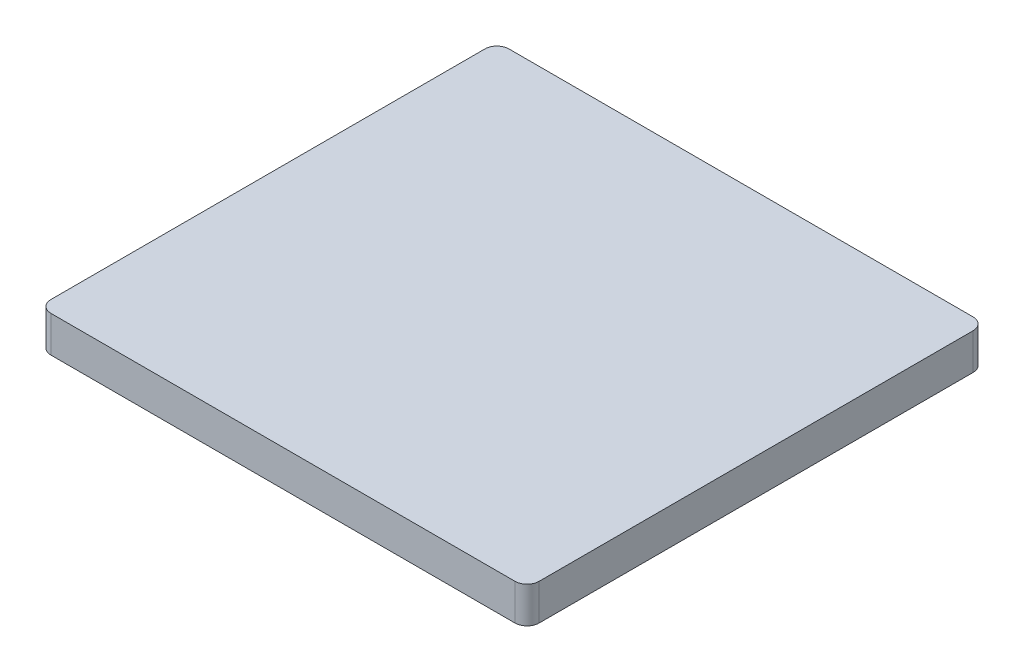
ISO-10303-21;
HEADER;
FILE_DESCRIPTION(('STEP AP214'),'2;1');
FILE_NAME('part.step','',(''),(''),'','','');
FILE_SCHEMA(('AUTOMOTIVE_DESIGN { 1 0 10303 214 1 1 1 1 }'));
ENDSEC;
DATA;
#1=APPLICATION_CONTEXT('core data for automotive mechanical design processes');
#2=APPLICATION_PROTOCOL_DEFINITION('international standard','automotive_design',2000,#1);
#3=PRODUCT_CONTEXT('',#1,'mechanical');
#4=PRODUCT('Part','Part','',(#3));
#5=PRODUCT_RELATED_PRODUCT_CATEGORY('part','',(#4));
#6=PRODUCT_DEFINITION_FORMATION('','',#4);
#7=PRODUCT_DEFINITION_CONTEXT('part definition',#1,'design');
#8=PRODUCT_DEFINITION('design','',#6,#7);
#9=PRODUCT_DEFINITION_SHAPE('','',#8);
#10=(LENGTH_UNIT() NAMED_UNIT(*) SI_UNIT(.MILLI.,.METRE.));
#11=(NAMED_UNIT(*) PLANE_ANGLE_UNIT() SI_UNIT($,.RADIAN.));
#12=(NAMED_UNIT(*) SI_UNIT($,.STERADIAN.) SOLID_ANGLE_UNIT());
#13=UNCERTAINTY_MEASURE_WITH_UNIT(LENGTH_MEASURE(1.E-05),#10,'distance_accuracy_value','');
#14=(GEOMETRIC_REPRESENTATION_CONTEXT(3) GLOBAL_UNCERTAINTY_ASSIGNED_CONTEXT((#13)) GLOBAL_UNIT_ASSIGNED_CONTEXT((#10,
#11,#12)) REPRESENTATION_CONTEXT('',''));
#15=CARTESIAN_POINT('',(0.,0.,0.));
#16=DIRECTION('',(0.,0.,1.));
#17=DIRECTION('',(1.,0.,0.));
#18=AXIS2_PLACEMENT_3D('',#15,#16,#17);
#19=CARTESIAN_POINT('',(0.,6.,76.));
#20=DIRECTION('',(1.,0.,0.));
#21=DIRECTION('',(0.,0.,-1.));
#22=AXIS2_PLACEMENT_3D('',#19,#20,#21);
#23=PLANE('',#22);
#24=DIRECTION('',(0.,0.,-1.));
#25=VECTOR('',#24,1.);
#26=CARTESIAN_POINT('',(0.,6.,76.));
#27=LINE('',#26,#25);
#28=CARTESIAN_POINT('',(0.,6.,74.));
#29=VERTEX_POINT('',#28);
#30=CARTESIAN_POINT('',(0.,6.,2.));
#31=VERTEX_POINT('',#30);
#32=EDGE_CURVE('E160',#29,#31,#27,.T.);
#33=ORIENTED_EDGE('',*,*,#32,.T.);
#34=DIRECTION('',(0.,-1.,0.));
#35=VECTOR('',#34,1.);
#36=CARTESIAN_POINT('',(0.,6.,2.));
#37=LINE('',#36,#35);
#38=CARTESIAN_POINT('',(0.,0.,2.));
#39=VERTEX_POINT('',#38);
#40=EDGE_CURVE('E124',#31,#39,#37,.T.);
#41=ORIENTED_EDGE('',*,*,#40,.T.);
#42=DIRECTION('',(0.,0.,-1.));
#43=VECTOR('',#42,1.);
#44=CARTESIAN_POINT('',(0.,0.,76.));
#45=LINE('',#44,#43);
#46=CARTESIAN_POINT('',(0.,0.,74.));
#47=VERTEX_POINT('',#46);
#48=EDGE_CURVE('E109',#47,#39,#45,.T.);
#49=ORIENTED_EDGE('',*,*,#48,.F.);
#50=DIRECTION('',(0.,-1.,0.));
#51=VECTOR('',#50,1.);
#52=CARTESIAN_POINT('',(0.,6.,74.));
#53=LINE('',#52,#51);
#54=EDGE_CURVE('E121',#47,#29,#53,.F.);
#55=ORIENTED_EDGE('',*,*,#54,.T.);
#56=EDGE_LOOP('',(#33,#41,#49,#55));
#57=FACE_BOUND('',#56,.T.);
#58=ADVANCED_FACE('F39',(#57),#23,.F.);
#59=CARTESIAN_POINT('',(0.,0.,76.));
#60=DIRECTION('',(0.,1.,0.));
#61=DIRECTION('',(0.,0.,1.));
#62=AXIS2_PLACEMENT_3D('',#59,#60,#61);
#63=PLANE('',#62);
#64=ORIENTED_EDGE('',*,*,#48,.T.);
#65=CARTESIAN_POINT('',(2.,0.,2.));
#66=DIRECTION('',(0.,1.,0.));
#67=DIRECTION('',(0.,0.,1.));
#68=AXIS2_PLACEMENT_3D('',#65,#66,#67);
#69=CIRCLE('',#68,2.);
#70=CARTESIAN_POINT('',(2.,0.,0.));
#71=VERTEX_POINT('',#70);
#72=EDGE_CURVE('E136',#39,#71,#69,.F.);
#73=ORIENTED_EDGE('',*,*,#72,.T.);
#74=DIRECTION('',(1.,0.,0.));
#75=VECTOR('',#74,1.);
#76=CARTESIAN_POINT('',(0.,0.,0.));
#77=LINE('',#76,#75);
#78=CARTESIAN_POINT('',(79.,0.,0.));
#79=VERTEX_POINT('',#78);
#80=EDGE_CURVE('E167',#71,#79,#77,.T.);
#81=ORIENTED_EDGE('',*,*,#80,.T.);
#82=CARTESIAN_POINT('',(79.,0.,2.));
#83=DIRECTION('',(0.,1.,0.));
#84=DIRECTION('',(0.,0.,1.));
#85=AXIS2_PLACEMENT_3D('',#82,#83,#84);
#86=CIRCLE('',#85,2.);
#87=CARTESIAN_POINT('',(81.,0.,2.));
#88=VERTEX_POINT('',#87);
#89=EDGE_CURVE('E115',#79,#88,#86,.F.);
#90=ORIENTED_EDGE('',*,*,#89,.T.);
#91=DIRECTION('',(0.,0.,-1.));
#92=VECTOR('',#91,1.);
#93=CARTESIAN_POINT('',(81.,0.,76.));
#94=LINE('',#93,#92);
#95=CARTESIAN_POINT('',(81.,0.,74.));
#96=VERTEX_POINT('',#95);
#97=EDGE_CURVE('E125',#96,#88,#94,.T.);
#98=ORIENTED_EDGE('',*,*,#97,.F.);
#99=CARTESIAN_POINT('',(79.,0.,74.));
#100=DIRECTION('',(0.,1.,0.));
#101=DIRECTION('',(0.,0.,1.));
#102=AXIS2_PLACEMENT_3D('',#99,#100,#101);
#103=CIRCLE('',#102,2.);
#104=CARTESIAN_POINT('',(79.,0.,76.));
#105=VERTEX_POINT('',#104);
#106=EDGE_CURVE('E116',#96,#105,#103,.F.);
#107=ORIENTED_EDGE('',*,*,#106,.T.);
#108=DIRECTION('',(1.,0.,0.));
#109=VECTOR('',#108,1.);
#110=CARTESIAN_POINT('',(0.,0.,76.));
#111=LINE('',#110,#109);
#112=CARTESIAN_POINT('',(2.,0.,76.));
#113=VERTEX_POINT('',#112);
#114=EDGE_CURVE('E111',#113,#105,#111,.T.);
#115=ORIENTED_EDGE('',*,*,#114,.F.);
#116=CARTESIAN_POINT('',(2.,0.,74.));
#117=DIRECTION('',(0.,1.,0.));
#118=DIRECTION('',(0.,0.,1.));
#119=AXIS2_PLACEMENT_3D('',#116,#117,#118);
#120=CIRCLE('',#119,2.);
#121=EDGE_CURVE('E106',#113,#47,#120,.F.);
#122=ORIENTED_EDGE('',*,*,#121,.T.);
#123=EDGE_LOOP('',(#64,#73,#81,#90,#98,#107,#115,#122));
#124=FACE_BOUND('',#123,.T.);
#125=ADVANCED_FACE('F108',(#124),#63,.F.);
#126=CARTESIAN_POINT('',(81.,0.,76.));
#127=DIRECTION('',(-1.,0.,0.));
#128=DIRECTION('',(0.,0.,1.));
#129=AXIS2_PLACEMENT_3D('',#126,#127,#128);
#130=PLANE('',#129);
#131=ORIENTED_EDGE('',*,*,#97,.T.);
#132=DIRECTION('',(0.,1.,0.));
#133=VECTOR('',#132,1.);
#134=CARTESIAN_POINT('',(81.,0.,2.));
#135=LINE('',#134,#133);
#136=CARTESIAN_POINT('',(81.,6.,2.));
#137=VERTEX_POINT('',#136);
#138=EDGE_CURVE('E149',#88,#137,#135,.T.);
#139=ORIENTED_EDGE('',*,*,#138,.T.);
#140=DIRECTION('',(0.,0.,-1.));
#141=VECTOR('',#140,1.);
#142=CARTESIAN_POINT('',(81.,6.,76.));
#143=LINE('',#142,#141);
#144=CARTESIAN_POINT('',(81.,6.,74.));
#145=VERTEX_POINT('',#144);
#146=EDGE_CURVE('E162',#145,#137,#143,.T.);
#147=ORIENTED_EDGE('',*,*,#146,.F.);
#148=DIRECTION('',(0.,1.,0.));
#149=VECTOR('',#148,1.);
#150=CARTESIAN_POINT('',(81.,0.,74.));
#151=LINE('',#150,#149);
#152=EDGE_CURVE('E147',#145,#96,#151,.F.);
#153=ORIENTED_EDGE('',*,*,#152,.T.);
#154=EDGE_LOOP('',(#131,#139,#147,#153));
#155=FACE_BOUND('',#154,.T.);
#156=ADVANCED_FACE('F174',(#155),#130,.F.);
#157=CARTESIAN_POINT('',(81.,6.,76.));
#158=DIRECTION('',(0.,-1.,0.));
#159=DIRECTION('',(0.,0.,-1.));
#160=AXIS2_PLACEMENT_3D('',#157,#158,#159);
#161=PLANE('',#160);
#162=DIRECTION('',(-1.,0.,0.));
#163=VECTOR('',#162,1.);
#164=CARTESIAN_POINT('',(81.,6.,0.));
#165=LINE('',#164,#163);
#166=CARTESIAN_POINT('',(79.,6.,0.));
#167=VERTEX_POINT('',#166);
#168=CARTESIAN_POINT('',(2.,6.,0.));
#169=VERTEX_POINT('',#168);
#170=EDGE_CURVE('E164',#167,#169,#165,.T.);
#171=ORIENTED_EDGE('',*,*,#170,.T.);
#172=CARTESIAN_POINT('',(2.,6.,2.));
#173=DIRECTION('',(0.,-1.,0.));
#174=DIRECTION('',(0.,0.,-1.));
#175=AXIS2_PLACEMENT_3D('',#172,#173,#174);
#176=CIRCLE('',#175,2.);
#177=EDGE_CURVE('E145',#169,#31,#176,.F.);
#178=ORIENTED_EDGE('',*,*,#177,.T.);
#179=ORIENTED_EDGE('',*,*,#32,.F.);
#180=CARTESIAN_POINT('',(2.,6.,74.));
#181=DIRECTION('',(0.,-1.,0.));
#182=DIRECTION('',(0.,0.,-1.));
#183=AXIS2_PLACEMENT_3D('',#180,#181,#182);
#184=CIRCLE('',#183,2.);
#185=CARTESIAN_POINT('',(2.,6.,76.));
#186=VERTEX_POINT('',#185);
#187=EDGE_CURVE('E129',#29,#186,#184,.F.);
#188=ORIENTED_EDGE('',*,*,#187,.T.);
#189=DIRECTION('',(-1.,0.,0.));
#190=VECTOR('',#189,1.);
#191=CARTESIAN_POINT('',(81.,6.,76.));
#192=LINE('',#191,#190);
#193=CARTESIAN_POINT('',(79.,6.,76.));
#194=VERTEX_POINT('',#193);
#195=EDGE_CURVE('E155',#194,#186,#192,.T.);
#196=ORIENTED_EDGE('',*,*,#195,.F.);
#197=CARTESIAN_POINT('',(79.,6.,74.));
#198=DIRECTION('',(0.,-1.,0.));
#199=DIRECTION('',(0.,0.,-1.));
#200=AXIS2_PLACEMENT_3D('',#197,#198,#199);
#201=CIRCLE('',#200,2.);
#202=EDGE_CURVE('E62',#194,#145,#201,.F.);
#203=ORIENTED_EDGE('',*,*,#202,.T.);
#204=ORIENTED_EDGE('',*,*,#146,.T.);
#205=CARTESIAN_POINT('',(79.,6.,2.));
#206=DIRECTION('',(0.,-1.,0.));
#207=DIRECTION('',(0.,0.,-1.));
#208=AXIS2_PLACEMENT_3D('',#205,#206,#207);
#209=CIRCLE('',#208,2.);
#210=EDGE_CURVE('E54',#137,#167,#209,.F.);
#211=ORIENTED_EDGE('',*,*,#210,.T.);
#212=EDGE_LOOP('',(#171,#178,#179,#188,#196,#203,#204,#211));
#213=FACE_BOUND('',#212,.T.);
#214=ADVANCED_FACE('F159',(#213),#161,.F.);
#215=CARTESIAN_POINT('',(0.,0.,76.));
#216=DIRECTION('',(0.,0.,1.));
#217=DIRECTION('',(1.,0.,0.));
#218=AXIS2_PLACEMENT_3D('',#215,#216,#217);
#219=PLANE('',#218);
#220=ORIENTED_EDGE('',*,*,#195,.T.);
#221=DIRECTION('',(0.,-1.,0.));
#222=VECTOR('',#221,1.);
#223=CARTESIAN_POINT('',(2.,0.,76.));
#224=LINE('',#223,#222);
#225=EDGE_CURVE('E11',#186,#113,#224,.T.);
#226=ORIENTED_EDGE('',*,*,#225,.T.);
#227=ORIENTED_EDGE('',*,*,#114,.T.);
#228=DIRECTION('',(0.,1.,0.));
#229=VECTOR('',#228,1.);
#230=CARTESIAN_POINT('',(79.,6.,76.));
#231=LINE('',#230,#229);
#232=EDGE_CURVE('E47',#105,#194,#231,.T.);
#233=ORIENTED_EDGE('',*,*,#232,.T.);
#234=EDGE_LOOP('',(#220,#226,#227,#233));
#235=FACE_BOUND('',#234,.T.);
#236=ADVANCED_FACE('F154',(#235),#219,.T.);
#237=CARTESIAN_POINT('',(0.,0.,0.));
#238=DIRECTION('',(0.,0.,1.));
#239=DIRECTION('',(1.,0.,0.));
#240=AXIS2_PLACEMENT_3D('',#237,#238,#239);
#241=PLANE('',#240);
#242=ORIENTED_EDGE('',*,*,#80,.F.);
#243=DIRECTION('',(0.,-1.,0.));
#244=VECTOR('',#243,1.);
#245=CARTESIAN_POINT('',(2.,0.,0.));
#246=LINE('',#245,#244);
#247=EDGE_CURVE('E140',#71,#169,#246,.F.);
#248=ORIENTED_EDGE('',*,*,#247,.T.);
#249=ORIENTED_EDGE('',*,*,#170,.F.);
#250=DIRECTION('',(0.,1.,0.));
#251=VECTOR('',#250,1.);
#252=CARTESIAN_POINT('',(79.,0.,0.));
#253=LINE('',#252,#251);
#254=EDGE_CURVE('E138',#167,#79,#253,.F.);
#255=ORIENTED_EDGE('',*,*,#254,.T.);
#256=EDGE_LOOP('',(#242,#248,#249,#255));
#257=FACE_BOUND('',#256,.T.);
#258=ADVANCED_FACE('F181',(#257),#241,.F.);
#259=CARTESIAN_POINT('',(2.,6.,2.));
#260=DIRECTION('',(0.,-1.,0.));
#261=DIRECTION('',(0.,0.,-1.));
#262=AXIS2_PLACEMENT_3D('',#259,#260,#261);
#263=CYLINDRICAL_SURFACE('',#262,2.);
#264=ORIENTED_EDGE('',*,*,#177,.F.);
#265=ORIENTED_EDGE('',*,*,#247,.F.);
#266=ORIENTED_EDGE('',*,*,#72,.F.);
#267=ORIENTED_EDGE('',*,*,#40,.F.);
#268=EDGE_LOOP('',(#264,#265,#266,#267));
#269=FACE_BOUND('',#268,.T.);
#270=ADVANCED_FACE('F185',(#269),#263,.T.);
#271=CARTESIAN_POINT('',(79.,0.,2.));
#272=DIRECTION('',(0.,1.,0.));
#273=DIRECTION('',(0.,0.,1.));
#274=AXIS2_PLACEMENT_3D('',#271,#272,#273);
#275=CYLINDRICAL_SURFACE('',#274,2.);
#276=ORIENTED_EDGE('',*,*,#89,.F.);
#277=ORIENTED_EDGE('',*,*,#254,.F.);
#278=ORIENTED_EDGE('',*,*,#210,.F.);
#279=ORIENTED_EDGE('',*,*,#138,.F.);
#280=EDGE_LOOP('',(#276,#277,#278,#279));
#281=FACE_BOUND('',#280,.T.);
#282=ADVANCED_FACE('F177',(#281),#275,.T.);
#283=CARTESIAN_POINT('',(2.,0.,74.));
#284=DIRECTION('',(0.,1.,0.));
#285=DIRECTION('',(0.,0.,1.));
#286=AXIS2_PLACEMENT_3D('',#283,#284,#285);
#287=CYLINDRICAL_SURFACE('',#286,2.);
#288=ORIENTED_EDGE('',*,*,#187,.F.);
#289=ORIENTED_EDGE('',*,*,#54,.F.);
#290=ORIENTED_EDGE('',*,*,#121,.F.);
#291=ORIENTED_EDGE('',*,*,#225,.F.);
#292=EDGE_LOOP('',(#288,#289,#290,#291));
#293=FACE_BOUND('',#292,.T.);
#294=ADVANCED_FACE('F128',(#293),#287,.T.);
#295=CARTESIAN_POINT('',(79.,0.,74.));
#296=DIRECTION('',(0.,-1.,0.));
#297=DIRECTION('',(0.,0.,-1.));
#298=AXIS2_PLACEMENT_3D('',#295,#296,#297);
#299=CYLINDRICAL_SURFACE('',#298,2.);
#300=ORIENTED_EDGE('',*,*,#106,.F.);
#301=ORIENTED_EDGE('',*,*,#152,.F.);
#302=ORIENTED_EDGE('',*,*,#202,.F.);
#303=ORIENTED_EDGE('',*,*,#232,.F.);
#304=EDGE_LOOP('',(#300,#301,#302,#303));
#305=FACE_BOUND('',#304,.T.);
#306=ADVANCED_FACE('F41',(#305),#299,.T.);
#307=CLOSED_SHELL('',(#58,#125,#156,#214,#236,#258,#270,#282,#294,#306));
#308=MANIFOLD_SOLID_BREP('B2',#307);
#309=ADVANCED_BREP_SHAPE_REPRESENTATION('',(#18,#308),#14);
#310=SHAPE_DEFINITION_REPRESENTATION(#9,#309);
ENDSEC;
END-ISO-10303-21;
